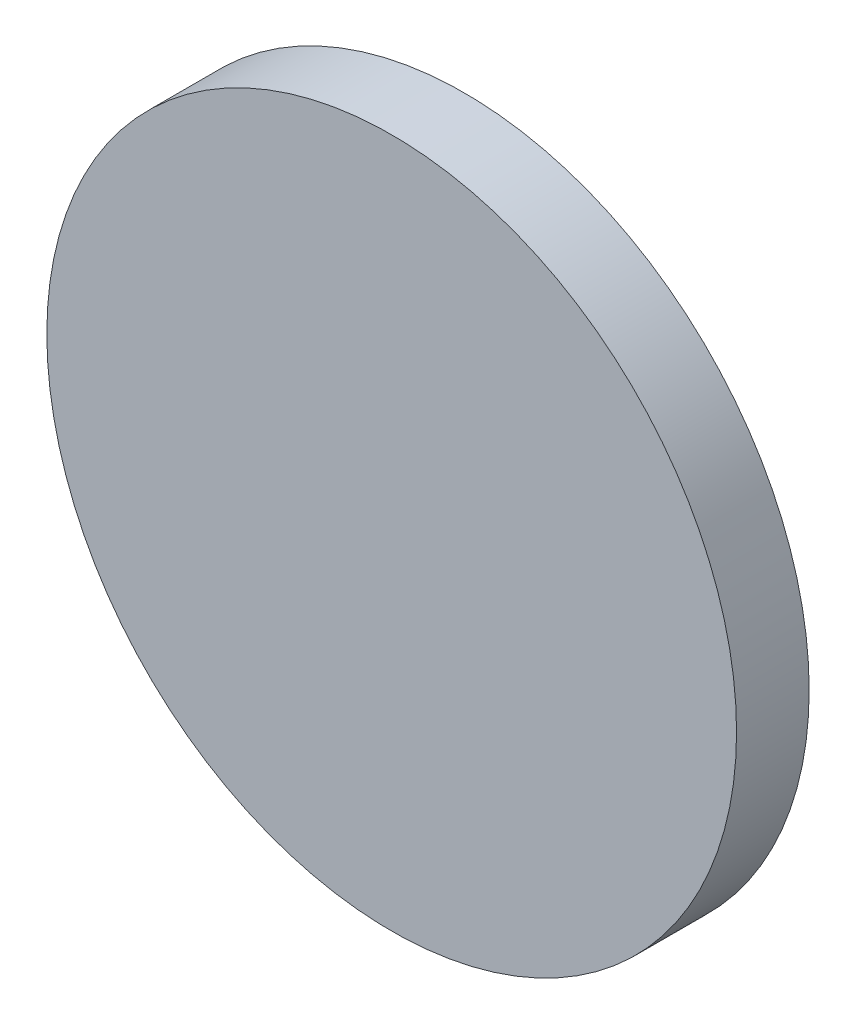
ISO-10303-21;
HEADER;
FILE_DESCRIPTION(('STEP AP214'),'2;1');
FILE_NAME('part.step','',(''),(''),'','','');
FILE_SCHEMA(('AUTOMOTIVE_DESIGN { 1 0 10303 214 1 1 1 1 }'));
ENDSEC;
DATA;
#1=APPLICATION_CONTEXT('core data for automotive mechanical design processes');
#2=APPLICATION_PROTOCOL_DEFINITION('international standard','automotive_design',2000,#1);
#3=PRODUCT_CONTEXT('',#1,'mechanical');
#4=PRODUCT('Part','Part','',(#3));
#5=PRODUCT_RELATED_PRODUCT_CATEGORY('part','',(#4));
#6=PRODUCT_DEFINITION_FORMATION('','',#4);
#7=PRODUCT_DEFINITION_CONTEXT('part definition',#1,'design');
#8=PRODUCT_DEFINITION('design','',#6,#7);
#9=PRODUCT_DEFINITION_SHAPE('','',#8);
#10=(LENGTH_UNIT() NAMED_UNIT(*) SI_UNIT(.MILLI.,.METRE.));
#11=(NAMED_UNIT(*) PLANE_ANGLE_UNIT() SI_UNIT($,.RADIAN.));
#12=(NAMED_UNIT(*) SI_UNIT($,.STERADIAN.) SOLID_ANGLE_UNIT());
#13=UNCERTAINTY_MEASURE_WITH_UNIT(LENGTH_MEASURE(1.E-05),#10,'distance_accuracy_value','');
#14=(GEOMETRIC_REPRESENTATION_CONTEXT(3) GLOBAL_UNCERTAINTY_ASSIGNED_CONTEXT((#13)) GLOBAL_UNIT_ASSIGNED_CONTEXT((#10,
#11,#12)) REPRESENTATION_CONTEXT('',''));
#15=CARTESIAN_POINT('',(0.,0.,0.));
#16=DIRECTION('',(0.,0.,1.));
#17=DIRECTION('',(1.,0.,0.));
#18=AXIS2_PLACEMENT_3D('',#15,#16,#17);
#19=CARTESIAN_POINT('',(0.,0.,2.));
#20=DIRECTION('',(0.,0.,-1.));
#21=DIRECTION('',(-1.,0.,0.));
#22=AXIS2_PLACEMENT_3D('',#19,#20,#21);
#23=CYLINDRICAL_SURFACE('',#22,9.5);
#24=CARTESIAN_POINT('',(0.,0.,2.));
#25=DIRECTION('',(0.,0.,1.));
#26=DIRECTION('',(1.,0.,0.));
#27=AXIS2_PLACEMENT_3D('',#24,#25,#26);
#28=CIRCLE('',#27,9.5);
#29=CARTESIAN_POINT('',(9.5,0.,2.));
#30=VERTEX_POINT('',#29);
#31=EDGE_CURVE('E10',#30,#30,#28,.T.);
#32=ORIENTED_EDGE('',*,*,#31,.F.);
#33=EDGE_LOOP('',(#32));
#34=FACE_BOUND('',#33,.T.);
#35=CARTESIAN_POINT('',(0.,0.,0.));
#36=DIRECTION('',(0.,0.,1.));
#37=DIRECTION('',(1.,0.,0.));
#38=AXIS2_PLACEMENT_3D('',#35,#36,#37);
#39=CIRCLE('',#38,9.5);
#40=CARTESIAN_POINT('',(9.5,0.,0.));
#41=VERTEX_POINT('',#40);
#42=EDGE_CURVE('E35',#41,#41,#39,.T.);
#43=ORIENTED_EDGE('',*,*,#42,.T.);
#44=EDGE_LOOP('',(#43));
#45=FACE_BOUND('',#44,.T.);
#46=ADVANCED_FACE('F32',(#34,#45),#23,.T.);
#47=CARTESIAN_POINT('',(0.,0.,2.));
#48=DIRECTION('',(0.,0.,1.));
#49=DIRECTION('',(1.,0.,0.));
#50=AXIS2_PLACEMENT_3D('',#47,#48,#49);
#51=PLANE('',#50);
#52=ORIENTED_EDGE('',*,*,#31,.T.);
#53=EDGE_LOOP('',(#52));
#54=FACE_BOUND('',#53,.T.);
#55=ADVANCED_FACE('F47',(#54),#51,.T.);
#56=CARTESIAN_POINT('',(0.,0.,0.));
#57=DIRECTION('',(0.,0.,1.));
#58=DIRECTION('',(1.,0.,0.));
#59=AXIS2_PLACEMENT_3D('',#56,#57,#58);
#60=PLANE('',#59);
#61=ORIENTED_EDGE('',*,*,#42,.F.);
#62=EDGE_LOOP('',(#61));
#63=FACE_BOUND('',#62,.T.);
#64=ADVANCED_FACE('F45',(#63),#60,.F.);
#65=CLOSED_SHELL('',(#46,#55,#64));
#66=MANIFOLD_SOLID_BREP('B2',#65);
#67=ADVANCED_BREP_SHAPE_REPRESENTATION('',(#18,#66),#14);
#68=SHAPE_DEFINITION_REPRESENTATION(#9,#67);
ENDSEC;
END-ISO-10303-21;
